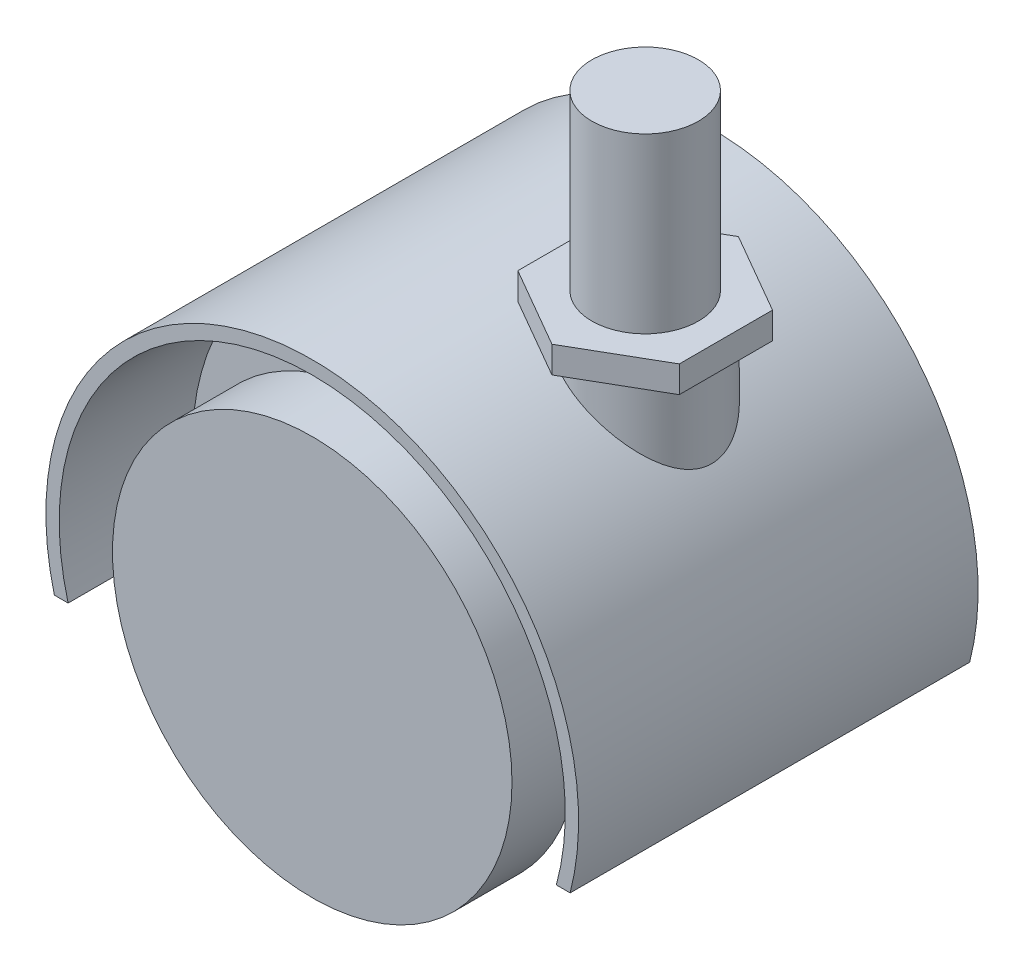
ISO-10303-21;
HEADER;
FILE_DESCRIPTION(('STEP AP214'),'2;1');
FILE_NAME('part.step','',(''),(''),'','','');
FILE_SCHEMA(('AUTOMOTIVE_DESIGN { 1 0 10303 214 1 1 1 1 }'));
ENDSEC;
DATA;
#1=APPLICATION_CONTEXT('core data for automotive mechanical design processes');
#2=APPLICATION_PROTOCOL_DEFINITION('international standard','automotive_design',2000,#1);
#3=PRODUCT_CONTEXT('',#1,'mechanical');
#4=PRODUCT('Part','Part','',(#3));
#5=PRODUCT_RELATED_PRODUCT_CATEGORY('part','',(#4));
#6=PRODUCT_DEFINITION_FORMATION('','',#4);
#7=PRODUCT_DEFINITION_CONTEXT('part definition',#1,'design');
#8=PRODUCT_DEFINITION('design','',#6,#7);
#9=PRODUCT_DEFINITION_SHAPE('','',#8);
#10=(LENGTH_UNIT() NAMED_UNIT(*) SI_UNIT(.MILLI.,.METRE.));
#11=(NAMED_UNIT(*) PLANE_ANGLE_UNIT() SI_UNIT($,.RADIAN.));
#12=(NAMED_UNIT(*) SI_UNIT($,.STERADIAN.) SOLID_ANGLE_UNIT());
#13=UNCERTAINTY_MEASURE_WITH_UNIT(LENGTH_MEASURE(1.E-05),#10,'distance_accuracy_value','');
#14=(GEOMETRIC_REPRESENTATION_CONTEXT(3) GLOBAL_UNCERTAINTY_ASSIGNED_CONTEXT((#13)) GLOBAL_UNIT_ASSIGNED_CONTEXT((#10,
#11,#12)) REPRESENTATION_CONTEXT('',''));
#15=CARTESIAN_POINT('',(0.,0.,0.));
#16=DIRECTION('',(0.,0.,1.));
#17=DIRECTION('',(1.,0.,0.));
#18=AXIS2_PLACEMENT_3D('',#15,#16,#17);
#19=CARTESIAN_POINT('',(0.,0.,15.));
#20=DIRECTION('',(0.,0.,-1.));
#21=DIRECTION('',(-1.,0.,0.));
#22=AXIS2_PLACEMENT_3D('',#19,#20,#21);
#23=CYLINDRICAL_SURFACE('',#22,19.);
#24=DIRECTION('',(0.,0.,-1.));
#25=VECTOR('',#24,1.);
#26=CARTESIAN_POINT('',(-18.3303027798234,-5.,15.));
#27=LINE('',#26,#25);
#28=CARTESIAN_POINT('',(-18.3303027798234,-5.,15.));
#29=VERTEX_POINT('',#28);
#30=CARTESIAN_POINT('',(-18.3303027798234,-5.,5.));
#31=VERTEX_POINT('',#30);
#32=EDGE_CURVE('E46',#29,#31,#27,.T.);
#33=ORIENTED_EDGE('',*,*,#32,.T.);
#34=CARTESIAN_POINT('',(0.,0.,5.));
#35=DIRECTION('',(0.,0.,1.));
#36=DIRECTION('',(1.,0.,0.));
#37=AXIS2_PLACEMENT_3D('',#34,#35,#36);
#38=CIRCLE('',#37,19.);
#39=CARTESIAN_POINT('',(18.3303027798234,-5.,5.));
#40=VERTEX_POINT('',#39);
#41=EDGE_CURVE('E291',#31,#40,#38,.F.);
#42=ORIENTED_EDGE('',*,*,#41,.T.);
#43=DIRECTION('',(0.,0.,-1.));
#44=VECTOR('',#43,1.);
#45=CARTESIAN_POINT('',(18.3303027798234,-5.,15.));
#46=LINE('',#45,#44);
#47=CARTESIAN_POINT('',(18.3303027798234,-5.,15.));
#48=VERTEX_POINT('',#47);
#49=EDGE_CURVE('E307',#48,#40,#46,.T.);
#50=ORIENTED_EDGE('',*,*,#49,.F.);
#51=CARTESIAN_POINT('',(0.,0.,15.));
#52=DIRECTION('',(0.,0.,1.));
#53=DIRECTION('',(1.,0.,0.));
#54=AXIS2_PLACEMENT_3D('',#51,#52,#53);
#55=CIRCLE('',#54,19.);
#56=EDGE_CURVE('E298',#29,#48,#55,.F.);
#57=ORIENTED_EDGE('',*,*,#56,.F.);
#58=EDGE_LOOP('',(#33,#42,#50,#57));
#59=FACE_BOUND('',#58,.T.);
#60=ADVANCED_FACE('F43',(#59),#23,.F.);
#61=CARTESIAN_POINT('',(0.,-5.,15.));
#62=DIRECTION('',(0.,1.,0.));
#63=DIRECTION('',(0.,0.,1.));
#64=AXIS2_PLACEMENT_3D('',#61,#62,#63);
#65=PLANE('',#64);
#66=DIRECTION('',(1.,0.,0.));
#67=VECTOR('',#66,1.);
#68=CARTESIAN_POINT('',(0.,-5.,-5.));
#69=LINE('',#68,#67);
#70=CARTESIAN_POINT('',(0.,-5.,-5.));
#71=VERTEX_POINT('',#70);
#72=CARTESIAN_POINT('',(18.3303027798234,-5.,-5.));
#73=VERTEX_POINT('',#72);
#74=EDGE_CURVE('E263',#71,#73,#69,.T.);
#75=ORIENTED_EDGE('',*,*,#74,.T.);
#76=DIRECTION('',(0.,0.,1.));
#77=VECTOR('',#76,1.);
#78=CARTESIAN_POINT('',(18.3303027798234,-5.,-15.));
#79=LINE('',#78,#77);
#80=CARTESIAN_POINT('',(18.3303027798234,-5.,-15.));
#81=VERTEX_POINT('',#80);
#82=EDGE_CURVE('E265',#81,#73,#79,.T.);
#83=ORIENTED_EDGE('',*,*,#82,.F.);
#84=DIRECTION('',(1.,0.,0.));
#85=VECTOR('',#84,1.);
#86=CARTESIAN_POINT('',(0.,-5.,-15.));
#87=LINE('',#86,#85);
#88=CARTESIAN_POINT('',(19.3649167310371,-5.,-15.));
#89=VERTEX_POINT('',#88);
#90=EDGE_CURVE('E325',#81,#89,#87,.T.);
#91=ORIENTED_EDGE('',*,*,#90,.T.);
#92=DIRECTION('',(0.,0.,-1.));
#93=VECTOR('',#92,1.);
#94=CARTESIAN_POINT('',(19.3649167310371,-5.,15.));
#95=LINE('',#94,#93);
#96=CARTESIAN_POINT('',(19.3649167310371,-5.,15.));
#97=VERTEX_POINT('',#96);
#98=EDGE_CURVE('E306',#97,#89,#95,.T.);
#99=ORIENTED_EDGE('',*,*,#98,.F.);
#100=DIRECTION('',(1.,0.,0.));
#101=VECTOR('',#100,1.);
#102=CARTESIAN_POINT('',(0.,-5.,15.));
#103=LINE('',#102,#101);
#104=EDGE_CURVE('E299',#48,#97,#103,.T.);
#105=ORIENTED_EDGE('',*,*,#104,.F.);
#106=ORIENTED_EDGE('',*,*,#49,.T.);
#107=DIRECTION('',(1.,0.,0.));
#108=VECTOR('',#107,1.);
#109=CARTESIAN_POINT('',(0.,-5.,5.));
#110=LINE('',#109,#108);
#111=CARTESIAN_POINT('',(0.,-5.,5.));
#112=VERTEX_POINT('',#111);
#113=EDGE_CURVE('E293',#112,#40,#110,.T.);
#114=ORIENTED_EDGE('',*,*,#113,.F.);
#115=EDGE_CURVE('E294',#31,#112,#110,.T.);
#116=ORIENTED_EDGE('',*,*,#115,.F.);
#117=ORIENTED_EDGE('',*,*,#32,.F.);
#118=CARTESIAN_POINT('',(-19.3649167310371,-5.,15.));
#119=VERTEX_POINT('',#118);
#120=EDGE_CURVE('E296',#119,#29,#103,.T.);
#121=ORIENTED_EDGE('',*,*,#120,.F.);
#122=DIRECTION('',(0.,0.,-1.));
#123=VECTOR('',#122,1.);
#124=CARTESIAN_POINT('',(-19.3649167310371,-5.,15.));
#125=LINE('',#124,#123);
#126=CARTESIAN_POINT('',(-19.3649167310371,-5.,-15.));
#127=VERTEX_POINT('',#126);
#128=EDGE_CURVE('E304',#119,#127,#125,.T.);
#129=ORIENTED_EDGE('',*,*,#128,.T.);
#130=CARTESIAN_POINT('',(-18.3303027798234,-5.,-15.));
#131=VERTEX_POINT('',#130);
#132=EDGE_CURVE('E326',#127,#131,#87,.T.);
#133=ORIENTED_EDGE('',*,*,#132,.T.);
#134=DIRECTION('',(0.,0.,1.));
#135=VECTOR('',#134,1.);
#136=CARTESIAN_POINT('',(-18.3303027798234,-5.,-15.));
#137=LINE('',#136,#135);
#138=CARTESIAN_POINT('',(-18.3303027798234,-5.,-5.));
#139=VERTEX_POINT('',#138);
#140=EDGE_CURVE('E275',#131,#139,#137,.T.);
#141=ORIENTED_EDGE('',*,*,#140,.T.);
#142=EDGE_CURVE('E268',#139,#71,#69,.T.);
#143=ORIENTED_EDGE('',*,*,#142,.T.);
#144=EDGE_LOOP('',(#75,#83,#91,#99,#105,#106,#114,#116,#117,#121,#129,#133,#141,#143));
#145=FACE_BOUND('',#144,.T.);
#146=ADVANCED_FACE('F247',(#145),#65,.F.);
#147=CARTESIAN_POINT('',(0.,0.,15.));
#148=DIRECTION('',(0.,0.,-1.));
#149=DIRECTION('',(-1.,0.,0.));
#150=AXIS2_PLACEMENT_3D('',#147,#148,#149);
#151=CYLINDRICAL_SURFACE('',#150,20.);
#152=CARTESIAN_POINT('',(10.,17.3205080756888,-5.));
#153=CARTESIAN_POINT('',(9.8604153262666,17.4010970692425,-4.99999975818832));
#154=CARTESIAN_POINT('',(9.71984498108352,17.4800014937527,-4.99415340570182));
#155=CARTESIAN_POINT('',(9.43763802155334,17.6339678774799,-4.97029164206854));
#156=CARTESIAN_POINT('',(9.29600148011752,17.7090300967546,-4.95227705569739));
#157=CARTESIAN_POINT('',(9.01246116824391,17.8549994204616,-4.90361972884346));
#158=CARTESIAN_POINT('',(8.87055731872166,17.9259000392788,-4.87295784546594));
#159=CARTESIAN_POINT('',(8.58794658846069,18.0629960445173,-4.79869132197964));
#160=CARTESIAN_POINT('',(8.44723913867075,18.1291937923904,-4.75509323527686));
#161=CARTESIAN_POINT('',(8.16748915862291,18.2569409886533,-4.65447296790362));
#162=CARTESIAN_POINT('',(8.02846000433315,18.3184629316761,-4.59737842469369));
#163=CARTESIAN_POINT('',(7.75436023936563,18.4361637860513,-4.46989210783414));
#164=CARTESIAN_POINT('',(7.61928794173563,18.4923449979812,-4.39950609900575));
#165=CARTESIAN_POINT('',(7.35460637010035,18.5991970181968,-4.24562325893004));
#166=CARTESIAN_POINT('',(7.22499500623773,18.6498699464084,-4.16213150203182));
#167=CARTESIAN_POINT('',(6.9727320906994,18.7456450959371,-3.98241447425677));
#168=CARTESIAN_POINT('',(6.85007979618693,18.7907479124356,-3.8861905661243));
#169=CARTESIAN_POINT('',(6.62452608201079,18.8713701545811,-3.69137183266894));
#170=CARTESIAN_POINT('',(6.52085575554818,18.9073930875705,-3.59387349820756));
#171=CARTESIAN_POINT('',(6.32153291803214,18.9749649853064,-3.38957837751967));
#172=CARTESIAN_POINT('',(6.22587980588597,19.0065142855875,-3.28278228962085));
#173=CARTESIAN_POINT('',(6.04361030207623,19.065254946864,-3.06065658919411));
#174=CARTESIAN_POINT('',(5.95699227405603,19.0924470974687,-2.9453285283933));
#175=CARTESIAN_POINT('',(5.79368412245667,19.1426363237278,-2.70698604928843));
#176=CARTESIAN_POINT('',(5.7169937121584,19.1656335205442,-2.58397185311954));
#177=CARTESIAN_POINT('',(5.57842415940364,19.2064077716013,-2.33845828561927));
#178=CARTESIAN_POINT('',(5.51594871589885,19.2244081814014,-2.21633198338722));
#179=CARTESIAN_POINT('',(5.40108435847898,19.2569949746329,-1.96693370615073));
#180=CARTESIAN_POINT('',(5.34869879679473,19.271580223768,-1.83966003793602));
#181=CARTESIAN_POINT('',(5.25453865931579,19.2974663752652,-1.58099102541517));
#182=CARTESIAN_POINT('',(5.21275914578851,19.3087688063248,-1.44959763121036));
#183=CARTESIAN_POINT('',(5.14013872096723,19.3282277871601,-1.18354126240446));
#184=CARTESIAN_POINT('',(5.10930184062703,19.3363831777524,-1.04887710242336));
#185=CARTESIAN_POINT('',(5.0592231550855,19.3495457828232,-0.779264890808702));
#186=CARTESIAN_POINT('',(5.03982123491122,19.3545965148348,-0.644348672713535));
#187=CARTESIAN_POINT('',(5.01208945232598,19.3617965446794,-0.373255880913673));
#188=CARTESIAN_POINT('',(5.00376363458865,19.3639447826096,-0.237078865070839));
#189=CARTESIAN_POINT('',(4.99826902444242,19.3653637935329,0.035462765767128));
#190=CARTESIAN_POINT('',(5.00109597269942,19.3646356650342,0.171827289265409));
#191=CARTESIAN_POINT('',(5.01787646085517,19.3602941783858,0.443874521917875));
#192=CARTESIAN_POINT('',(5.0318341049378,19.3566797559822,0.579556960995464));
#193=CARTESIAN_POINT('',(5.07072814529723,19.3465272944007,0.848982869663555));
#194=CARTESIAN_POINT('',(5.09564509075955,19.3399944346104,0.982729342802838));
#195=CARTESIAN_POINT('',(5.15625189622706,19.3239242515474,1.24762660418355));
#196=CARTESIAN_POINT('',(5.19194571433599,19.314385824341,1.37877641984056));
#197=CARTESIAN_POINT('',(5.27377944790255,19.2922016568969,1.63744693430605));
#198=CARTESIAN_POINT('',(5.31991511132571,19.279557181298,1.76496908661103));
#199=CARTESIAN_POINT('',(5.42225490368093,19.2510252613616,2.01558430856487));
#200=CARTESIAN_POINT('',(5.47846273499887,19.2351366242159,2.13867572949191));
#201=CARTESIAN_POINT('',(5.60046526187061,19.1999691312937,2.37956223572451));
#202=CARTESIAN_POINT('',(5.66626272517007,19.1806892964212,2.49735577907669));
#203=CARTESIAN_POINT('',(5.80683480280325,19.138601317066,2.72681250476879));
#204=CARTESIAN_POINT('',(5.88161268656764,19.1157918867143,2.83847343276426));
#205=CARTESIAN_POINT('',(6.11838522632869,19.0418655948512,3.16299877955254));
#206=CARTESIAN_POINT('',(6.29295589043074,18.9852126645898,3.36567453970135));
#207=CARTESIAN_POINT('',(6.67063818076833,18.8558395158658,3.73988658978823));
#208=CARTESIAN_POINT('',(6.87398595363238,18.7829831769795,3.9111351930503));
#209=CARTESIAN_POINT('',(7.30080862641299,18.6212304719675,4.21702461237994));
#210=CARTESIAN_POINT('',(7.52428551355206,18.5323325212818,4.35166180874568));
#211=CARTESIAN_POINT('',(7.99259086409466,18.3353583650559,4.58711328221617));
#212=CARTESIAN_POINT('',(8.23790818572983,18.2266811874337,4.68644586030689));
#213=CARTESIAN_POINT('',(8.73433574121701,17.9940716505937,4.84417286228654));
#214=CARTESIAN_POINT('',(8.98544802842973,17.8701338143912,4.90255253771747));
#215=CARTESIAN_POINT('',(9.50954175343064,17.5972595887401,4.98357280808005));
#216=CARTESIAN_POINT('',(9.78244202225438,17.4470755180674,5.00249370618794));
#217=CARTESIAN_POINT('',(10.320475831491,17.1343167890779,4.99697668033432));
#218=CARTESIAN_POINT('',(10.5856065974996,16.9717377775376,4.97252345519929));
#219=CARTESIAN_POINT('',(11.1395648403023,16.6142529915591,4.8776110397289));
#220=CARTESIAN_POINT('',(11.4264990125226,16.4180117549889,4.80117925059555));
#221=CARTESIAN_POINT('',(11.9792242193277,16.0191909634397,4.60100398410189));
#222=CARTESIAN_POINT('',(12.2449860786403,15.816603180475,4.47719654080397));
#223=CARTESIAN_POINT('',(12.6417561937683,15.4990365902161,4.24837559628625));
#224=CARTESIAN_POINT('',(12.7814735925552,15.3839325808949,4.15826187195866));
#225=CARTESIAN_POINT('',(13.0520455905091,15.1550472087676,3.96393327116848));
#226=CARTESIAN_POINT('',(13.1828979837278,15.0412661809615,3.85971490413681));
#227=CARTESIAN_POINT('',(13.4347712752083,14.816725768266,3.63738144002567));
#228=CARTESIAN_POINT('',(13.5558008690265,14.7059637697998,3.51927886573938));
#229=CARTESIAN_POINT('',(13.7871179571689,14.4893233509162,3.26905989441944));
#230=CARTESIAN_POINT('',(13.8974109050553,14.3834424657308,3.13695068390104));
#231=CARTESIAN_POINT('',(14.1385207993885,14.1470418887623,2.81508574028281));
#232=CARTESIAN_POINT('',(14.2650772118184,14.0190797343396,2.62016737522787));
#233=CARTESIAN_POINT('',(14.493446818842,13.7828499777836,2.20562346461079));
#234=CARTESIAN_POINT('',(14.5953056170907,13.6745461713542,1.98604456876158));
#235=CARTESIAN_POINT('',(14.7501894443428,13.5071131306676,1.57268707257157));
#236=CARTESIAN_POINT('',(14.8089973175046,13.4424219729924,1.38340630896011));
#237=CARTESIAN_POINT('',(14.8806056376433,13.3629650365342,1.09078258129129));
#238=CARTESIAN_POINT('',(14.9017086597966,13.3394083998437,0.991784203223858));
#239=CARTESIAN_POINT('',(14.9380145506153,13.2987394098084,0.791428391304067));
#240=CARTESIAN_POINT('',(14.9532200684654,13.2816241630658,0.690072038403347));
#241=CARTESIAN_POINT('',(14.9775067625881,13.2542306641086,0.484945060740217));
#242=CARTESIAN_POINT('',(14.9865425047823,13.2440031403164,0.381162225447775));
#243=CARTESIAN_POINT('',(14.9981037463607,13.2309093090191,0.172768491844034));
#244=CARTESIAN_POINT('',(15.0006292862394,13.2280429557262,0.0681575986874477));
#245=CARTESIAN_POINT('',(14.9991057391335,13.2297706048697,-0.140954733520271));
#246=CARTESIAN_POINT('',(14.9950569352445,13.2343642860722,-0.245456177090484));
#247=CARTESIAN_POINT('',(14.9804934805557,13.2508462526036,-0.453395667349208));
#248=CARTESIAN_POINT('',(14.969979049459,13.2627342900692,-0.556833750049462));
#249=CARTESIAN_POINT('',(14.9318467050662,13.3056892444577,-0.843347853014705));
#250=CARTESIAN_POINT('',(14.8972771897161,13.3444896281809,-1.0244215904098));
#251=CARTESIAN_POINT('',(14.8101743849799,13.4410908378449,-1.37669983136162));
#252=CARTESIAN_POINT('',(14.7576316906585,13.4989016108547,-1.54789911293037));
#253=CARTESIAN_POINT('',(14.6077900423983,13.6612481726642,-1.95867633695261));
#254=CARTESIAN_POINT('',(14.5011337198991,13.7748620759531,-2.19130562579265));
#255=CARTESIAN_POINT('',(14.3207367461078,13.9615224435108,-2.5193118332143));
#256=CARTESIAN_POINT('',(14.257077550859,14.026572742782,-2.62531874559137));
#257=CARTESIAN_POINT('',(14.1235386024112,14.1610242951867,-2.83043719713772));
#258=CARTESIAN_POINT('',(14.0536603949811,14.2304244658752,-2.92955043891497));
#259=CARTESIAN_POINT('',(13.8811594735206,14.3990579657906,-3.15655234322182));
#260=CARTESIAN_POINT('',(13.7760278756169,14.499783038357,-3.28142499406191));
#261=CARTESIAN_POINT('',(13.5561421468251,14.7055671886295,-3.5185222678104));
#262=CARTESIAN_POINT('',(13.4413845412596,14.8106278243213,-3.63074228896708));
#263=CARTESIAN_POINT('',(13.2029837536827,15.0235411467021,-3.84270202958059));
#264=CARTESIAN_POINT('',(13.0793318430146,15.1313965078036,-3.94242921839168));
#265=CARTESIAN_POINT('',(12.8239437558489,15.3484380266803,-4.12920860830539));
#266=CARTESIAN_POINT('',(12.692208670605,15.4576240032303,-4.21626251501243));
#267=CARTESIAN_POINT('',(12.4187802597792,15.6781792604332,-4.37895710196092));
#268=CARTESIAN_POINT('',(12.2769496645788,15.7895522258222,-4.45436216833724));
#269=CARTESIAN_POINT('',(11.9861133377779,16.0114504901986,-4.59142656664039));
#270=CARTESIAN_POINT('',(11.8371064398091,16.1219756479843,-4.65308365487077));
#271=CARTESIAN_POINT('',(11.5330353122974,16.3408719587411,-4.76191208429006));
#272=CARTESIAN_POINT('',(11.377988785626,16.4492481810003,-4.80912262697472));
#273=CARTESIAN_POINT('',(11.0623057912815,16.663184217304,-4.88855556911118));
#274=CARTESIAN_POINT('',(10.9016723496327,16.7687455028969,-4.92078595042069));
#275=CARTESIAN_POINT('',(10.6178782866902,16.9493715781905,-4.96317982531205));
#276=CARTESIAN_POINT('',(10.4957657156648,17.0252654011742,-4.97689400784711));
#277=CARTESIAN_POINT('',(10.2493665539565,17.1747271004968,-4.99530624633804));
#278=CARTESIAN_POINT('',(10.125079003846,17.2482939080079,-5.00000021668255));
#279=CARTESIAN_POINT('',(10.,17.3205080756888,-5.));
#280=B_SPLINE_CURVE_WITH_KNOTS('',3,(#152,#153,#154,#155,#156,#157,#158,#159,#160,#161,#162,
#163,#164,#165,#166,#167,#168,#169,#170,#171,#172,#173,#174,#175,#176,#177,#178,#179,#180,#181,
#182,#183,#184,#185,#186,#187,#188,#189,#190,#191,#192,#193,#194,#195,#196,#197,#198,#199,#200,
#201,#202,#203,#204,#205,#206,#207,#208,#209,#210,#211,#212,#213,#214,#215,#216,#217,#218,#219,
#220,#221,#222,#223,#224,#225,#226,#227,#228,#229,#230,#231,#232,#233,#234,#235,#236,#237,#238,
#239,#240,#241,#242,#243,#244,#245,#246,#247,#248,#249,#250,#251,#252,#253,#254,#255,#256,#257,
#258,#259,#260,#261,#262,#263,#264,#265,#266,#267,#268,#269,#270,#271,#272,#273,#274,#275,#276,
#277,#278,#279),.UNSPECIFIED.,.T.,.F.,(4,2,2,2,2,2,2,2,2,2,2,2,2,2,2,2,2,2,2,2,2,2,2,2,2,2,2,2,
2,2,2,2,2,2,2,2,2,2,2,2,2,2,2,2,2,2,2,2,2,2,2,2,2,2,2,2,2,2,2,2,2,2,2,4),(0.,0.483426546000466,
0.966820328131892,1.45094847364372,1.93483178015278,2.42137079543227,2.90769926997445,
3.39383990778596,3.87992855514267,4.3197721486,4.75958273511458,5.19931352811151,
5.63903161842648,6.05359672116677,6.46829932103512,6.88280849716608,7.29747020852543,
7.70617859523747,8.11503618955149,8.52373765286806,8.93258988501369,9.34071938684877,
9.74899896822078,10.1571125918252,10.5653765410883,10.9737585571051,11.3822897028275,
12.1984510136149,13.0217466518393,13.8451236582044,14.6998265884991,15.5548371670185,
16.4873584914358,17.4202088486372,18.4839214619552,19.5490753817182,20.155131348747,
20.7613375756481,21.3670011731537,21.9723555074047,22.7656706573542,23.5575096167143,
24.1803224250639,24.4917692436097,24.803075996404,25.1166511719831,25.4302243970698,
25.7437841198431,26.057333188398,26.6199280555393,27.1828177666276,28.0177956746068,
28.4367011109477,28.8555027153518,29.4301430396528,30.0049916905833,30.5804123903552,
31.1557555767269,31.7415328040375,32.3274055614587,32.9116741271513,33.495631019966,
33.9286237000019,34.3618124533887),.UNSPECIFIED.);
#281=CARTESIAN_POINT('',(10.,17.3205080756888,-5.));
#282=VERTEX_POINT('',#281);
#283=EDGE_CURVE('E11',#282,#282,#280,.T.);
#284=ORIENTED_EDGE('',*,*,#283,.F.);
#285=EDGE_LOOP('',(#284));
#286=FACE_BOUND('',#285,.T.);
#287=ORIENTED_EDGE('',*,*,#98,.T.);
#288=CARTESIAN_POINT('',(0.,0.,-15.));
#289=DIRECTION('',(0.,0.,1.));
#290=DIRECTION('',(1.,0.,0.));
#291=AXIS2_PLACEMENT_3D('',#288,#289,#290);
#292=CIRCLE('',#291,20.);
#293=EDGE_CURVE('E323',#127,#89,#292,.F.);
#294=ORIENTED_EDGE('',*,*,#293,.F.);
#295=ORIENTED_EDGE('',*,*,#128,.F.);
#296=CARTESIAN_POINT('',(0.,0.,15.));
#297=DIRECTION('',(0.,0.,1.));
#298=DIRECTION('',(1.,0.,0.));
#299=AXIS2_PLACEMENT_3D('',#296,#297,#298);
#300=CIRCLE('',#299,20.);
#301=EDGE_CURVE('E301',#119,#97,#300,.F.);
#302=ORIENTED_EDGE('',*,*,#301,.T.);
#303=EDGE_LOOP('',(#287,#294,#295,#302));
#304=FACE_BOUND('',#303,.T.);
#305=ADVANCED_FACE('F182',(#286,#304),#151,.T.);
#306=CARTESIAN_POINT('',(0.,0.,15.));
#307=DIRECTION('',(0.,0.,1.));
#308=DIRECTION('',(1.,0.,0.));
#309=AXIS2_PLACEMENT_3D('',#306,#307,#308);
#310=PLANE('',#309);
#311=ORIENTED_EDGE('',*,*,#120,.T.);
#312=ORIENTED_EDGE('',*,*,#56,.T.);
#313=ORIENTED_EDGE('',*,*,#104,.T.);
#314=ORIENTED_EDGE('',*,*,#301,.F.);
#315=EDGE_LOOP('',(#311,#312,#313,#314));
#316=FACE_BOUND('',#315,.T.);
#317=ADVANCED_FACE('F238',(#316),#310,.T.);
#318=CARTESIAN_POINT('',(0.,0.,5.));
#319=DIRECTION('',(0.,0.,1.));
#320=DIRECTION('',(1.,0.,0.));
#321=AXIS2_PLACEMENT_3D('',#318,#319,#320);
#322=PLANE('',#321);
#323=ORIENTED_EDGE('',*,*,#113,.T.);
#324=ORIENTED_EDGE('',*,*,#41,.F.);
#325=ORIENTED_EDGE('',*,*,#115,.T.);
#326=CARTESIAN_POINT('',(0.,0.,5.));
#327=DIRECTION('',(0.,0.,1.));
#328=DIRECTION('',(1.,0.,0.));
#329=AXIS2_PLACEMENT_3D('',#326,#327,#328);
#330=CIRCLE('',#329,5.);
#331=EDGE_CURVE('E274',#112,#112,#330,.T.);
#332=ORIENTED_EDGE('',*,*,#331,.F.);
#333=EDGE_LOOP('',(#323,#324,#325,#332));
#334=FACE_BOUND('',#333,.T.);
#335=ADVANCED_FACE('F229',(#334),#322,.T.);
#336=CARTESIAN_POINT('',(0.,0.,10.));
#337=DIRECTION('',(0.,0.,1.));
#338=DIRECTION('',(1.,0.,0.));
#339=AXIS2_PLACEMENT_3D('',#336,#337,#338);
#340=PLANE('',#339);
#341=CARTESIAN_POINT('',(0.,0.,10.));
#342=DIRECTION('',(0.,0.,1.));
#343=DIRECTION('',(1.,0.,0.));
#344=AXIS2_PLACEMENT_3D('',#341,#342,#343);
#345=CIRCLE('',#344,15.);
#346=CARTESIAN_POINT('',(15.,0.,10.));
#347=VERTEX_POINT('',#346);
#348=EDGE_CURVE('E284',#347,#347,#345,.T.);
#349=ORIENTED_EDGE('',*,*,#348,.F.);
#350=EDGE_LOOP('',(#349));
#351=FACE_BOUND('',#350,.T.);
#352=CARTESIAN_POINT('',(0.,0.,10.));
#353=DIRECTION('',(0.,0.,1.));
#354=DIRECTION('',(1.,0.,0.));
#355=AXIS2_PLACEMENT_3D('',#352,#353,#354);
#356=CIRCLE('',#355,5.);
#357=CARTESIAN_POINT('',(5.,0.,10.));
#358=VERTEX_POINT('',#357);
#359=EDGE_CURVE('E278',#358,#358,#356,.T.);
#360=ORIENTED_EDGE('',*,*,#359,.T.);
#361=EDGE_LOOP('',(#360));
#362=FACE_BOUND('',#361,.T.);
#363=ADVANCED_FACE('F225',(#351,#362),#340,.F.);
#364=CARTESIAN_POINT('',(0.,0.,10.));
#365=DIRECTION('',(0.,0.,-1.));
#366=DIRECTION('',(-1.,0.,0.));
#367=AXIS2_PLACEMENT_3D('',#364,#365,#366);
#368=CYLINDRICAL_SURFACE('',#367,5.);
#369=ORIENTED_EDGE('',*,*,#359,.F.);
#370=EDGE_LOOP('',(#369));
#371=FACE_BOUND('',#370,.T.);
#372=ORIENTED_EDGE('',*,*,#331,.T.);
#373=EDGE_LOOP('',(#372));
#374=FACE_BOUND('',#373,.T.);
#375=ADVANCED_FACE('F221',(#371,#374),#368,.T.);
#376=CARTESIAN_POINT('',(0.,0.,15.));
#377=DIRECTION('',(0.,0.,1.));
#378=DIRECTION('',(1.,0.,0.));
#379=AXIS2_PLACEMENT_3D('',#376,#377,#378);
#380=PLANE('',#379);
#381=CARTESIAN_POINT('',(0.,0.,15.));
#382=DIRECTION('',(0.,0.,1.));
#383=DIRECTION('',(1.,0.,0.));
#384=AXIS2_PLACEMENT_3D('',#381,#382,#383);
#385=CIRCLE('',#384,15.);
#386=CARTESIAN_POINT('',(15.,0.,15.));
#387=VERTEX_POINT('',#386);
#388=EDGE_CURVE('E288',#387,#387,#385,.T.);
#389=ORIENTED_EDGE('',*,*,#388,.T.);
#390=EDGE_LOOP('',(#389));
#391=FACE_BOUND('',#390,.T.);
#392=ADVANCED_FACE('F224',(#391),#380,.T.);
#393=CARTESIAN_POINT('',(0.,0.,15.));
#394=DIRECTION('',(0.,0.,-1.));
#395=DIRECTION('',(-1.,0.,0.));
#396=AXIS2_PLACEMENT_3D('',#393,#394,#395);
#397=CYLINDRICAL_SURFACE('',#396,15.);
#398=ORIENTED_EDGE('',*,*,#348,.T.);
#399=EDGE_LOOP('',(#398));
#400=FACE_BOUND('',#399,.T.);
#401=ORIENTED_EDGE('',*,*,#388,.F.);
#402=EDGE_LOOP('',(#401));
#403=FACE_BOUND('',#402,.T.);
#404=ADVANCED_FACE('F220',(#400,#403),#397,.T.);
#405=CARTESIAN_POINT('',(0.,0.,-15.));
#406=DIRECTION('',(0.,0.,1.));
#407=DIRECTION('',(1.,0.,0.));
#408=AXIS2_PLACEMENT_3D('',#405,#406,#407);
#409=CYLINDRICAL_SURFACE('',#408,19.);
#410=CARTESIAN_POINT('',(0.,0.,-5.));
#411=DIRECTION('',(0.,0.,1.));
#412=DIRECTION('',(1.,0.,0.));
#413=AXIS2_PLACEMENT_3D('',#410,#411,#412);
#414=CIRCLE('',#413,19.);
#415=EDGE_CURVE('E58',#139,#73,#414,.F.);
#416=ORIENTED_EDGE('',*,*,#415,.F.);
#417=ORIENTED_EDGE('',*,*,#140,.F.);
#418=CARTESIAN_POINT('',(0.,0.,-15.));
#419=DIRECTION('',(0.,0.,1.));
#420=DIRECTION('',(1.,0.,0.));
#421=AXIS2_PLACEMENT_3D('',#418,#419,#420);
#422=CIRCLE('',#421,19.);
#423=EDGE_CURVE('E273',#131,#81,#422,.F.);
#424=ORIENTED_EDGE('',*,*,#423,.T.);
#425=ORIENTED_EDGE('',*,*,#82,.T.);
#426=EDGE_LOOP('',(#416,#417,#424,#425));
#427=FACE_BOUND('',#426,.T.);
#428=ADVANCED_FACE('F216',(#427),#409,.F.);
#429=CARTESIAN_POINT('',(0.,0.,-15.));
#430=DIRECTION('',(0.,0.,-1.));
#431=DIRECTION('',(1.,0.,0.));
#432=AXIS2_PLACEMENT_3D('',#429,#430,#431);
#433=PLANE('',#432);
#434=ORIENTED_EDGE('',*,*,#132,.F.);
#435=ORIENTED_EDGE('',*,*,#293,.T.);
#436=ORIENTED_EDGE('',*,*,#90,.F.);
#437=ORIENTED_EDGE('',*,*,#423,.F.);
#438=EDGE_LOOP('',(#434,#435,#436,#437));
#439=FACE_BOUND('',#438,.T.);
#440=ADVANCED_FACE('F212',(#439),#433,.T.);
#441=CARTESIAN_POINT('',(0.,0.,-5.));
#442=DIRECTION('',(0.,0.,-1.));
#443=DIRECTION('',(1.,0.,0.));
#444=AXIS2_PLACEMENT_3D('',#441,#442,#443);
#445=PLANE('',#444);
#446=ORIENTED_EDGE('',*,*,#415,.T.);
#447=ORIENTED_EDGE('',*,*,#74,.F.);
#448=CARTESIAN_POINT('',(0.,0.,-5.));
#449=DIRECTION('',(0.,0.,1.));
#450=DIRECTION('',(1.,0.,0.));
#451=AXIS2_PLACEMENT_3D('',#448,#449,#450);
#452=CIRCLE('',#451,5.);
#453=EDGE_CURVE('E173',#71,#71,#452,.T.);
#454=ORIENTED_EDGE('',*,*,#453,.T.);
#455=ORIENTED_EDGE('',*,*,#142,.F.);
#456=EDGE_LOOP('',(#446,#447,#454,#455));
#457=FACE_BOUND('',#456,.T.);
#458=ADVANCED_FACE('F202',(#457),#445,.T.);
#459=CARTESIAN_POINT('',(0.,0.,-10.));
#460=DIRECTION('',(0.,0.,-1.));
#461=DIRECTION('',(1.,0.,0.));
#462=AXIS2_PLACEMENT_3D('',#459,#460,#461);
#463=PLANE('',#462);
#464=CARTESIAN_POINT('',(0.,0.,-10.));
#465=DIRECTION('',(0.,0.,1.));
#466=DIRECTION('',(1.,0.,0.));
#467=AXIS2_PLACEMENT_3D('',#464,#465,#466);
#468=CIRCLE('',#467,5.);
#469=CARTESIAN_POINT('',(5.,0.,-10.));
#470=VERTEX_POINT('',#469);
#471=EDGE_CURVE('E180',#470,#470,#468,.T.);
#472=ORIENTED_EDGE('',*,*,#471,.F.);
#473=EDGE_LOOP('',(#472));
#474=FACE_BOUND('',#473,.T.);
#475=CARTESIAN_POINT('',(0.,0.,-10.));
#476=DIRECTION('',(0.,0.,1.));
#477=DIRECTION('',(1.,0.,0.));
#478=AXIS2_PLACEMENT_3D('',#475,#476,#477);
#479=CIRCLE('',#478,15.);
#480=CARTESIAN_POINT('',(15.,0.,-10.));
#481=VERTEX_POINT('',#480);
#482=EDGE_CURVE('E334',#481,#481,#479,.T.);
#483=ORIENTED_EDGE('',*,*,#482,.T.);
#484=EDGE_LOOP('',(#483));
#485=FACE_BOUND('',#484,.T.);
#486=ADVANCED_FACE('F198',(#474,#485),#463,.F.);
#487=CARTESIAN_POINT('',(0.,0.,-10.));
#488=DIRECTION('',(0.,0.,1.));
#489=DIRECTION('',(1.,0.,0.));
#490=AXIS2_PLACEMENT_3D('',#487,#488,#489);
#491=CYLINDRICAL_SURFACE('',#490,5.);
#492=ORIENTED_EDGE('',*,*,#471,.T.);
#493=EDGE_LOOP('',(#492));
#494=FACE_BOUND('',#493,.T.);
#495=ORIENTED_EDGE('',*,*,#453,.F.);
#496=EDGE_LOOP('',(#495));
#497=FACE_BOUND('',#496,.T.);
#498=ADVANCED_FACE('F194',(#494,#497),#491,.T.);
#499=CARTESIAN_POINT('',(0.,0.,-15.));
#500=DIRECTION('',(0.,0.,-1.));
#501=DIRECTION('',(1.,0.,0.));
#502=AXIS2_PLACEMENT_3D('',#499,#500,#501);
#503=PLANE('',#502);
#504=CARTESIAN_POINT('',(0.,0.,-15.));
#505=DIRECTION('',(0.,0.,1.));
#506=DIRECTION('',(1.,0.,0.));
#507=AXIS2_PLACEMENT_3D('',#504,#505,#506);
#508=CIRCLE('',#507,15.);
#509=CARTESIAN_POINT('',(15.,0.,-15.));
#510=VERTEX_POINT('',#509);
#511=EDGE_CURVE('E331',#510,#510,#508,.T.);
#512=ORIENTED_EDGE('',*,*,#511,.F.);
#513=EDGE_LOOP('',(#512));
#514=FACE_BOUND('',#513,.T.);
#515=ADVANCED_FACE('F197',(#514),#503,.T.);
#516=CARTESIAN_POINT('',(0.,0.,-15.));
#517=DIRECTION('',(0.,0.,1.));
#518=DIRECTION('',(1.,0.,0.));
#519=AXIS2_PLACEMENT_3D('',#516,#517,#518);
#520=CYLINDRICAL_SURFACE('',#519,15.);
#521=ORIENTED_EDGE('',*,*,#482,.F.);
#522=EDGE_LOOP('',(#521));
#523=FACE_BOUND('',#522,.T.);
#524=ORIENTED_EDGE('',*,*,#511,.T.);
#525=EDGE_LOOP('',(#524));
#526=FACE_BOUND('',#525,.T.);
#527=ADVANCED_FACE('F190',(#523,#526),#520,.T.);
#528=CARTESIAN_POINT('',(10.,20.,0.));
#529=DIRECTION('',(0.,-1.,0.));
#530=DIRECTION('',(0.,0.,-1.));
#531=AXIS2_PLACEMENT_3D('',#528,#529,#530);
#532=CYLINDRICAL_SURFACE('',#531,5.);
#533=ORIENTED_EDGE('',*,*,#283,.T.);
#534=EDGE_LOOP('',(#533));
#535=FACE_BOUND('',#534,.T.);
#536=CARTESIAN_POINT('',(10.,20.,0.));
#537=DIRECTION('',(0.,1.,0.));
#538=DIRECTION('',(0.,0.,1.));
#539=AXIS2_PLACEMENT_3D('',#536,#537,#538);
#540=CIRCLE('',#539,5.);
#541=CARTESIAN_POINT('',(10.,20.,5.));
#542=VERTEX_POINT('',#541);
#543=EDGE_CURVE('E163',#542,#542,#540,.F.);
#544=ORIENTED_EDGE('',*,*,#543,.T.);
#545=EDGE_LOOP('',(#544));
#546=FACE_BOUND('',#545,.T.);
#547=ADVANCED_FACE('F185',(#535,#546),#532,.T.);
#548=CARTESIAN_POINT('',(0.,22.,0.));
#549=DIRECTION('',(0.,1.,0.));
#550=DIRECTION('',(0.,0.,1.));
#551=AXIS2_PLACEMENT_3D('',#548,#549,#550);
#552=PLANE('',#551);
#553=DIRECTION('',(-0.866025403784439,0.,-0.5));
#554=VECTOR('',#553,1.);
#555=CARTESIAN_POINT('',(16.0621778264911,22.,-3.50000000000001));
#556=LINE('',#555,#554);
#557=CARTESIAN_POINT('',(16.0621778264911,22.,-3.50000000000001));
#558=VERTEX_POINT('',#557);
#559=CARTESIAN_POINT('',(10.,22.,-7.00000000000001));
#560=VERTEX_POINT('',#559);
#561=EDGE_CURVE('E148',#558,#560,#556,.T.);
#562=ORIENTED_EDGE('',*,*,#561,.T.);
#563=DIRECTION('',(-0.866025403784439,0.,0.5));
#564=VECTOR('',#563,1.);
#565=CARTESIAN_POINT('',(10.,22.,-7.00000000000001));
#566=LINE('',#565,#564);
#567=CARTESIAN_POINT('',(3.93782217350892,22.,-3.5));
#568=VERTEX_POINT('',#567);
#569=EDGE_CURVE('E137',#560,#568,#566,.T.);
#570=ORIENTED_EDGE('',*,*,#569,.T.);
#571=DIRECTION('',(0.,0.,1.));
#572=VECTOR('',#571,1.);
#573=CARTESIAN_POINT('',(3.93782217350892,22.,-3.5));
#574=LINE('',#573,#572);
#575=CARTESIAN_POINT('',(3.93782217350892,22.,3.50000000000001));
#576=VERTEX_POINT('',#575);
#577=EDGE_CURVE('E147',#568,#576,#574,.T.);
#578=ORIENTED_EDGE('',*,*,#577,.T.);
#579=DIRECTION('',(0.866025403784439,0.,0.5));
#580=VECTOR('',#579,1.);
#581=CARTESIAN_POINT('',(3.93782217350892,22.,3.50000000000001));
#582=LINE('',#581,#580);
#583=CARTESIAN_POINT('',(10.,22.,7.00000000000001));
#584=VERTEX_POINT('',#583);
#585=EDGE_CURVE('E474',#576,#584,#582,.T.);
#586=ORIENTED_EDGE('',*,*,#585,.T.);
#587=DIRECTION('',(0.866025403784438,0.,-0.5));
#588=VECTOR('',#587,1.);
#589=CARTESIAN_POINT('',(10.,22.,7.00000000000001));
#590=LINE('',#589,#588);
#591=CARTESIAN_POINT('',(16.0621778264911,22.,3.5));
#592=VERTEX_POINT('',#591);
#593=EDGE_CURVE('E476',#584,#592,#590,.T.);
#594=ORIENTED_EDGE('',*,*,#593,.T.);
#595=DIRECTION('',(0.,0.,-1.));
#596=VECTOR('',#595,1.);
#597=CARTESIAN_POINT('',(16.0621778264911,22.,3.5));
#598=LINE('',#597,#596);
#599=EDGE_CURVE('E154',#592,#558,#598,.T.);
#600=ORIENTED_EDGE('',*,*,#599,.T.);
#601=EDGE_LOOP('',(#562,#570,#578,#586,#594,#600));
#602=FACE_BOUND('',#601,.T.);
#603=CARTESIAN_POINT('',(10.,22.,0.));
#604=DIRECTION('',(0.,1.,0.));
#605=DIRECTION('',(0.,0.,1.));
#606=AXIS2_PLACEMENT_3D('',#603,#604,#605);
#607=CIRCLE('',#606,4.);
#608=CARTESIAN_POINT('',(10.,22.,4.));
#609=VERTEX_POINT('',#608);
#610=EDGE_CURVE('E467',#609,#609,#607,.T.);
#611=ORIENTED_EDGE('',*,*,#610,.F.);
#612=EDGE_LOOP('',(#611));
#613=FACE_BOUND('',#612,.T.);
#614=ADVANCED_FACE('F151',(#602,#613),#552,.T.);
#615=CARTESIAN_POINT('',(0.,20.,0.));
#616=DIRECTION('',(0.,1.,0.));
#617=DIRECTION('',(0.,0.,1.));
#618=AXIS2_PLACEMENT_3D('',#615,#616,#617);
#619=PLANE('',#618);
#620=ORIENTED_EDGE('',*,*,#543,.F.);
#621=EDGE_LOOP('',(#620));
#622=FACE_BOUND('',#621,.T.);
#623=DIRECTION('',(-0.866025403784439,0.,-0.5));
#624=VECTOR('',#623,1.);
#625=CARTESIAN_POINT('',(16.0621778264911,20.,-3.50000000000001));
#626=LINE('',#625,#624);
#627=CARTESIAN_POINT('',(16.0621778264911,20.,-3.50000000000001));
#628=VERTEX_POINT('',#627);
#629=CARTESIAN_POINT('',(10.,20.,-7.00000000000001));
#630=VERTEX_POINT('',#629);
#631=EDGE_CURVE('E162',#628,#630,#626,.T.);
#632=ORIENTED_EDGE('',*,*,#631,.F.);
#633=DIRECTION('',(0.,0.,-1.));
#634=VECTOR('',#633,1.);
#635=CARTESIAN_POINT('',(16.0621778264911,20.,3.5));
#636=LINE('',#635,#634);
#637=CARTESIAN_POINT('',(16.0621778264911,20.,3.5));
#638=VERTEX_POINT('',#637);
#639=EDGE_CURVE('E158',#638,#628,#636,.T.);
#640=ORIENTED_EDGE('',*,*,#639,.F.);
#641=DIRECTION('',(0.866025403784438,0.,-0.5));
#642=VECTOR('',#641,1.);
#643=CARTESIAN_POINT('',(10.,20.,7.00000000000001));
#644=LINE('',#643,#642);
#645=CARTESIAN_POINT('',(10.,20.,7.00000000000001));
#646=VERTEX_POINT('',#645);
#647=EDGE_CURVE('E485',#646,#638,#644,.T.);
#648=ORIENTED_EDGE('',*,*,#647,.F.);
#649=DIRECTION('',(0.866025403784439,0.,0.5));
#650=VECTOR('',#649,1.);
#651=CARTESIAN_POINT('',(3.93782217350892,20.,3.50000000000001));
#652=LINE('',#651,#650);
#653=CARTESIAN_POINT('',(3.93782217350892,20.,3.50000000000001));
#654=VERTEX_POINT('',#653);
#655=EDGE_CURVE('E483',#654,#646,#652,.T.);
#656=ORIENTED_EDGE('',*,*,#655,.F.);
#657=DIRECTION('',(0.,0.,1.));
#658=VECTOR('',#657,1.);
#659=CARTESIAN_POINT('',(3.93782217350892,20.,-3.5));
#660=LINE('',#659,#658);
#661=CARTESIAN_POINT('',(3.93782217350892,20.,-3.5));
#662=VERTEX_POINT('',#661);
#663=EDGE_CURVE('E481',#662,#654,#660,.T.);
#664=ORIENTED_EDGE('',*,*,#663,.F.);
#665=DIRECTION('',(-0.866025403784439,0.,0.5));
#666=VECTOR('',#665,1.);
#667=CARTESIAN_POINT('',(10.,20.,-7.00000000000001));
#668=LINE('',#667,#666);
#669=EDGE_CURVE('E470',#630,#662,#668,.T.);
#670=ORIENTED_EDGE('',*,*,#669,.F.);
#671=EDGE_LOOP('',(#632,#640,#648,#656,#664,#670));
#672=FACE_BOUND('',#671,.T.);
#673=ADVANCED_FACE('F390',(#622,#672),#619,.F.);
#674=CARTESIAN_POINT('',(16.0621778264911,22.,-3.50000000000001));
#675=DIRECTION('',(-0.5,0.,0.866025403784439));
#676=DIRECTION('',(0.866025403784439,0.,0.5));
#677=AXIS2_PLACEMENT_3D('',#674,#675,#676);
#678=PLANE('',#677);
#679=ORIENTED_EDGE('',*,*,#631,.T.);
#680=DIRECTION('',(0.,-1.,0.));
#681=VECTOR('',#680,1.);
#682=CARTESIAN_POINT('',(10.,22.,-7.00000000000001));
#683=LINE('',#682,#681);
#684=EDGE_CURVE('E141',#560,#630,#683,.T.);
#685=ORIENTED_EDGE('',*,*,#684,.F.);
#686=ORIENTED_EDGE('',*,*,#561,.F.);
#687=DIRECTION('',(0.,-1.,0.));
#688=VECTOR('',#687,1.);
#689=CARTESIAN_POINT('',(16.0621778264911,22.,-3.50000000000001));
#690=LINE('',#689,#688);
#691=EDGE_CURVE('E478',#558,#628,#690,.T.);
#692=ORIENTED_EDGE('',*,*,#691,.T.);
#693=EDGE_LOOP('',(#679,#685,#686,#692));
#694=FACE_BOUND('',#693,.T.);
#695=ADVANCED_FACE('F160',(#694),#678,.F.);
#696=CARTESIAN_POINT('',(10.,22.,-7.00000000000001));
#697=DIRECTION('',(0.5,0.,0.866025403784439));
#698=DIRECTION('',(0.866025403784439,0.,-0.5));
#699=AXIS2_PLACEMENT_3D('',#696,#697,#698);
#700=PLANE('',#699);
#701=ORIENTED_EDGE('',*,*,#669,.T.);
#702=DIRECTION('',(0.,-1.,0.));
#703=VECTOR('',#702,1.);
#704=CARTESIAN_POINT('',(3.93782217350892,22.,-3.5));
#705=LINE('',#704,#703);
#706=EDGE_CURVE('E144',#568,#662,#705,.T.);
#707=ORIENTED_EDGE('',*,*,#706,.F.);
#708=ORIENTED_EDGE('',*,*,#569,.F.);
#709=ORIENTED_EDGE('',*,*,#684,.T.);
#710=EDGE_LOOP('',(#701,#707,#708,#709));
#711=FACE_BOUND('',#710,.T.);
#712=ADVANCED_FACE('F139',(#711),#700,.F.);
#713=CARTESIAN_POINT('',(3.93782217350892,22.,-3.5));
#714=DIRECTION('',(1.,0.,0.));
#715=DIRECTION('',(0.,0.,-1.));
#716=AXIS2_PLACEMENT_3D('',#713,#714,#715);
#717=PLANE('',#716);
#718=ORIENTED_EDGE('',*,*,#663,.T.);
#719=DIRECTION('',(0.,-1.,0.));
#720=VECTOR('',#719,1.);
#721=CARTESIAN_POINT('',(3.93782217350892,22.,3.50000000000001));
#722=LINE('',#721,#720);
#723=EDGE_CURVE('E168',#576,#654,#722,.T.);
#724=ORIENTED_EDGE('',*,*,#723,.F.);
#725=ORIENTED_EDGE('',*,*,#577,.F.);
#726=ORIENTED_EDGE('',*,*,#706,.T.);
#727=EDGE_LOOP('',(#718,#724,#725,#726));
#728=FACE_BOUND('',#727,.T.);
#729=ADVANCED_FACE('F416',(#728),#717,.F.);
#730=CARTESIAN_POINT('',(3.93782217350892,22.,3.50000000000001));
#731=DIRECTION('',(0.5,0.,-0.866025403784439));
#732=DIRECTION('',(-0.866025403784439,0.,-0.5));
#733=AXIS2_PLACEMENT_3D('',#730,#731,#732);
#734=PLANE('',#733);
#735=ORIENTED_EDGE('',*,*,#655,.T.);
#736=DIRECTION('',(0.,-1.,0.));
#737=VECTOR('',#736,1.);
#738=CARTESIAN_POINT('',(10.,22.,7.00000000000001));
#739=LINE('',#738,#737);
#740=EDGE_CURVE('E492',#584,#646,#739,.T.);
#741=ORIENTED_EDGE('',*,*,#740,.F.);
#742=ORIENTED_EDGE('',*,*,#585,.F.);
#743=ORIENTED_EDGE('',*,*,#723,.T.);
#744=EDGE_LOOP('',(#735,#741,#742,#743));
#745=FACE_BOUND('',#744,.T.);
#746=ADVANCED_FACE('F425',(#745),#734,.F.);
#747=CARTESIAN_POINT('',(10.,22.,7.00000000000001));
#748=DIRECTION('',(-0.5,0.,-0.866025403784438));
#749=DIRECTION('',(-0.866025403784438,0.,0.5));
#750=AXIS2_PLACEMENT_3D('',#747,#748,#749);
#751=PLANE('',#750);
#752=ORIENTED_EDGE('',*,*,#647,.T.);
#753=DIRECTION('',(0.,-1.,0.));
#754=VECTOR('',#753,1.);
#755=CARTESIAN_POINT('',(16.0621778264911,22.,3.5));
#756=LINE('',#755,#754);
#757=EDGE_CURVE('E489',#592,#638,#756,.T.);
#758=ORIENTED_EDGE('',*,*,#757,.F.);
#759=ORIENTED_EDGE('',*,*,#593,.F.);
#760=ORIENTED_EDGE('',*,*,#740,.T.);
#761=EDGE_LOOP('',(#752,#758,#759,#760));
#762=FACE_BOUND('',#761,.T.);
#763=ADVANCED_FACE('F435',(#762),#751,.F.);
#764=CARTESIAN_POINT('',(16.0621778264911,22.,3.5));
#765=DIRECTION('',(-1.,0.,0.));
#766=DIRECTION('',(0.,0.,1.));
#767=AXIS2_PLACEMENT_3D('',#764,#765,#766);
#768=PLANE('',#767);
#769=ORIENTED_EDGE('',*,*,#639,.T.);
#770=ORIENTED_EDGE('',*,*,#691,.F.);
#771=ORIENTED_EDGE('',*,*,#599,.F.);
#772=ORIENTED_EDGE('',*,*,#757,.T.);
#773=EDGE_LOOP('',(#769,#770,#771,#772));
#774=FACE_BOUND('',#773,.T.);
#775=ADVANCED_FACE('F379',(#774),#768,.F.);
#776=CARTESIAN_POINT('',(0.,35.,0.));
#777=DIRECTION('',(0.,1.,0.));
#778=DIRECTION('',(0.,0.,1.));
#779=AXIS2_PLACEMENT_3D('',#776,#777,#778);
#780=PLANE('',#779);
#781=CARTESIAN_POINT('',(10.,35.,0.));
#782=DIRECTION('',(0.,1.,0.));
#783=DIRECTION('',(0.,0.,1.));
#784=AXIS2_PLACEMENT_3D('',#781,#782,#783);
#785=CIRCLE('',#784,4.);
#786=CARTESIAN_POINT('',(10.,35.,4.));
#787=VERTEX_POINT('',#786);
#788=EDGE_CURVE('E166',#787,#787,#785,.T.);
#789=ORIENTED_EDGE('',*,*,#788,.T.);
#790=EDGE_LOOP('',(#789));
#791=FACE_BOUND('',#790,.T.);
#792=ADVANCED_FACE('F375',(#791),#780,.T.);
#793=CARTESIAN_POINT('',(10.,35.,0.));
#794=DIRECTION('',(0.,-1.,0.));
#795=DIRECTION('',(0.,0.,-1.));
#796=AXIS2_PLACEMENT_3D('',#793,#794,#795);
#797=CYLINDRICAL_SURFACE('',#796,4.);
#798=ORIENTED_EDGE('',*,*,#610,.T.);
#799=EDGE_LOOP('',(#798));
#800=FACE_BOUND('',#799,.T.);
#801=ORIENTED_EDGE('',*,*,#788,.F.);
#802=EDGE_LOOP('',(#801));
#803=FACE_BOUND('',#802,.T.);
#804=ADVANCED_FACE('F192',(#800,#803),#797,.T.);
#805=CLOSED_SHELL('',(#60,#146,#305,#317,#335,#363,#375,#392,#404,#428,#440,#458,#486,#498,#515,
#527,#547,#614,#673,#695,#712,#729,#746,#763,#775,#792,#804));
#806=MANIFOLD_SOLID_BREP('B2',#805);
#807=ADVANCED_BREP_SHAPE_REPRESENTATION('',(#18,#806),#14);
#808=SHAPE_DEFINITION_REPRESENTATION(#9,#807);
ENDSEC;
END-ISO-10303-21;
